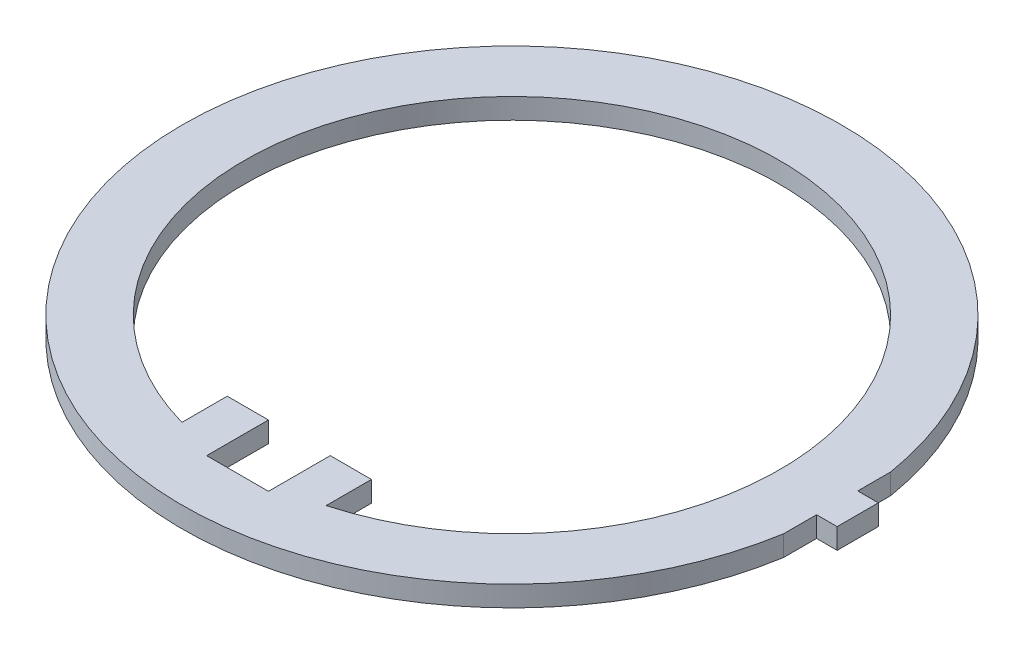
ISO-10303-21;
HEADER;
FILE_DESCRIPTION(('STEP AP214'),'2;1');
FILE_NAME('part.step','',(''),(''),'','','');
FILE_SCHEMA(('AUTOMOTIVE_DESIGN { 1 0 10303 214 1 1 1 1 }'));
ENDSEC;
DATA;
#1=APPLICATION_CONTEXT('core data for automotive mechanical design processes');
#2=APPLICATION_PROTOCOL_DEFINITION('international standard','automotive_design',2000,#1);
#3=PRODUCT_CONTEXT('',#1,'mechanical');
#4=PRODUCT('Part','Part','',(#3));
#5=PRODUCT_RELATED_PRODUCT_CATEGORY('part','',(#4));
#6=PRODUCT_DEFINITION_FORMATION('','',#4);
#7=PRODUCT_DEFINITION_CONTEXT('part definition',#1,'design');
#8=PRODUCT_DEFINITION('design','',#6,#7);
#9=PRODUCT_DEFINITION_SHAPE('','',#8);
#10=(LENGTH_UNIT() NAMED_UNIT(*) SI_UNIT(.MILLI.,.METRE.));
#11=(NAMED_UNIT(*) PLANE_ANGLE_UNIT() SI_UNIT($,.RADIAN.));
#12=(NAMED_UNIT(*) SI_UNIT($,.STERADIAN.) SOLID_ANGLE_UNIT());
#13=UNCERTAINTY_MEASURE_WITH_UNIT(LENGTH_MEASURE(1.E-05),#10,'distance_accuracy_value','');
#14=(GEOMETRIC_REPRESENTATION_CONTEXT(3) GLOBAL_UNCERTAINTY_ASSIGNED_CONTEXT((#13)) GLOBAL_UNIT_ASSIGNED_CONTEXT((#10,
#11,#12)) REPRESENTATION_CONTEXT('',''));
#15=CARTESIAN_POINT('',(0.,0.,0.));
#16=DIRECTION('',(0.,0.,1.));
#17=DIRECTION('',(1.,0.,0.));
#18=AXIS2_PLACEMENT_3D('',#15,#16,#17);
#19=CARTESIAN_POINT('',(9.525,6.35,-84.5818985622356));
#20=DIRECTION('',(0.,1.,0.));
#21=DIRECTION('',(0.,0.,1.));
#22=AXIS2_PLACEMENT_3D('',#19,#20,#21);
#23=PLANE('',#22);
#24=CARTESIAN_POINT('',(9.525,6.35,-84.5818985622356));
#25=DIRECTION('',(0.,1.,0.));
#26=DIRECTION('',(0.,0.,1.));
#27=AXIS2_PLACEMENT_3D('',#24,#25,#26);
#28=CIRCLE('',#27,101.6);
#29=CARTESIAN_POINT('',(109.774588029079,6.35,-101.091898562236));
#30=VERTEX_POINT('',#29);
#31=CARTESIAN_POINT('',(109.774588029079,6.35,-68.0718985622356));
#32=VERTEX_POINT('',#31);
#33=EDGE_CURVE('E199',#30,#32,#28,.T.);
#34=ORIENTED_EDGE('',*,*,#33,.T.);
#35=DIRECTION('',(0.,0.,-1.));
#36=VECTOR('',#35,1.);
#37=CARTESIAN_POINT('',(109.774588029079,6.35,-78.2318985622356));
#38=LINE('',#37,#36);
#39=CARTESIAN_POINT('',(109.774588029079,6.35,-78.2318985622356));
#40=VERTEX_POINT('',#39);
#41=EDGE_CURVE('E202',#32,#40,#38,.T.);
#42=ORIENTED_EDGE('',*,*,#41,.T.);
#43=DIRECTION('',(1.,0.,0.));
#44=VECTOR('',#43,1.);
#45=CARTESIAN_POINT('',(116.124588029079,6.35,-78.2318985622356));
#46=LINE('',#45,#44);
#47=CARTESIAN_POINT('',(116.124588029079,6.35,-78.2318985622356));
#48=VERTEX_POINT('',#47);
#49=EDGE_CURVE('E205',#40,#48,#46,.T.);
#50=ORIENTED_EDGE('',*,*,#49,.T.);
#51=DIRECTION('',(0.,0.,-1.));
#52=VECTOR('',#51,1.);
#53=CARTESIAN_POINT('',(116.124588029079,6.35,-90.9318985622356));
#54=LINE('',#53,#52);
#55=CARTESIAN_POINT('',(116.124588029079,6.35,-90.9318985622356));
#56=VERTEX_POINT('',#55);
#57=EDGE_CURVE('E207',#48,#56,#54,.T.);
#58=ORIENTED_EDGE('',*,*,#57,.T.);
#59=DIRECTION('',(-1.,0.,0.));
#60=VECTOR('',#59,1.);
#61=CARTESIAN_POINT('',(109.774588029079,6.35,-90.9318985622356));
#62=LINE('',#61,#60);
#63=CARTESIAN_POINT('',(109.774588029079,6.35,-90.9318985622356));
#64=VERTEX_POINT('',#63);
#65=EDGE_CURVE('E209',#56,#64,#62,.T.);
#66=ORIENTED_EDGE('',*,*,#65,.T.);
#67=DIRECTION('',(0.,0.,-1.));
#68=VECTOR('',#67,1.);
#69=CARTESIAN_POINT('',(109.774588029079,6.35,-101.091898562236));
#70=LINE('',#69,#68);
#71=EDGE_CURVE('E211',#64,#30,#70,.T.);
#72=ORIENTED_EDGE('',*,*,#71,.T.);
#73=EDGE_LOOP('',(#34,#42,#50,#58,#66,#72));
#74=FACE_BOUND('',#73,.T.);
#75=DIRECTION('',(1.,0.,0.));
#76=VECTOR('',#75,1.);
#77=CARTESIAN_POINT('',(0.,6.35,0.));
#78=LINE('',#77,#76);
#79=CARTESIAN_POINT('',(0.,6.35,0.));
#80=VERTEX_POINT('',#79);
#81=CARTESIAN_POINT('',(19.05,6.35,0.));
#82=VERTEX_POINT('',#81);
#83=EDGE_CURVE('E142',#80,#82,#78,.T.);
#84=ORIENTED_EDGE('',*,*,#83,.F.);
#85=DIRECTION('',(0.,0.,1.));
#86=VECTOR('',#85,1.);
#87=CARTESIAN_POINT('',(0.,6.35,0.));
#88=LINE('',#87,#86);
#89=CARTESIAN_POINT('',(0.,6.35,-19.05));
#90=VERTEX_POINT('',#89);
#91=EDGE_CURVE('E134',#90,#80,#88,.T.);
#92=ORIENTED_EDGE('',*,*,#91,.F.);
#93=DIRECTION('',(1.,0.,0.));
#94=VECTOR('',#93,1.);
#95=CARTESIAN_POINT('',(0.,6.35,-19.05));
#96=LINE('',#95,#94);
#97=CARTESIAN_POINT('',(-12.7,6.35,-19.05));
#98=VERTEX_POINT('',#97);
#99=EDGE_CURVE('E167',#98,#90,#96,.T.);
#100=ORIENTED_EDGE('',*,*,#99,.F.);
#101=DIRECTION('',(0.,0.,-1.));
#102=VECTOR('',#101,1.);
#103=CARTESIAN_POINT('',(-12.7,6.35,-19.05));
#104=LINE('',#103,#102);
#105=CARTESIAN_POINT('',(-12.7,6.35,-5.07999999999997));
#106=VERTEX_POINT('',#105);
#107=EDGE_CURVE('E165',#106,#98,#104,.T.);
#108=ORIENTED_EDGE('',*,*,#107,.F.);
#109=CARTESIAN_POINT('',(9.525,6.35,-84.5818985622356));
#110=DIRECTION('',(0.,1.,0.));
#111=DIRECTION('',(0.,0.,-1.));
#112=AXIS2_PLACEMENT_3D('',#109,#110,#111);
#113=CIRCLE('',#112,82.55);
#114=CARTESIAN_POINT('',(31.75,6.35,-5.08));
#115=VERTEX_POINT('',#114);
#116=EDGE_CURVE('E163',#115,#106,#113,.T.);
#117=ORIENTED_EDGE('',*,*,#116,.F.);
#118=DIRECTION('',(0.,0.,1.));
#119=VECTOR('',#118,1.);
#120=CARTESIAN_POINT('',(31.75,6.35,-19.05));
#121=LINE('',#120,#119);
#122=CARTESIAN_POINT('',(31.75,6.35,-19.05));
#123=VERTEX_POINT('',#122);
#124=EDGE_CURVE('E161',#123,#115,#121,.T.);
#125=ORIENTED_EDGE('',*,*,#124,.F.);
#126=DIRECTION('',(1.,0.,0.));
#127=VECTOR('',#126,1.);
#128=CARTESIAN_POINT('',(19.05,6.35,-19.05));
#129=LINE('',#128,#127);
#130=CARTESIAN_POINT('',(19.05,6.35,-19.05));
#131=VERTEX_POINT('',#130);
#132=EDGE_CURVE('E157',#131,#123,#129,.T.);
#133=ORIENTED_EDGE('',*,*,#132,.F.);
#134=DIRECTION('',(0.,0.,-1.));
#135=VECTOR('',#134,1.);
#136=CARTESIAN_POINT('',(19.05,6.35,0.));
#137=LINE('',#136,#135);
#138=EDGE_CURVE('E155',#82,#131,#137,.T.);
#139=ORIENTED_EDGE('',*,*,#138,.F.);
#140=EDGE_LOOP('',(#84,#92,#100,#108,#117,#125,#133,#139));
#141=FACE_BOUND('',#140,.T.);
#142=ADVANCED_FACE('F33',(#74,#141),#23,.T.);
#143=CARTESIAN_POINT('',(9.525,0.,-84.5818985622356));
#144=DIRECTION('',(0.,1.,0.));
#145=DIRECTION('',(0.,0.,1.));
#146=AXIS2_PLACEMENT_3D('',#143,#144,#145);
#147=PLANE('',#146);
#148=CARTESIAN_POINT('',(9.525,0.,-84.5818985622356));
#149=DIRECTION('',(0.,1.,0.));
#150=DIRECTION('',(0.,0.,1.));
#151=AXIS2_PLACEMENT_3D('',#148,#149,#150);
#152=CIRCLE('',#151,101.6);
#153=CARTESIAN_POINT('',(109.774588029079,0.,-101.091898562236));
#154=VERTEX_POINT('',#153);
#155=CARTESIAN_POINT('',(109.774588029079,0.,-68.0718985622356));
#156=VERTEX_POINT('',#155);
#157=EDGE_CURVE('E150',#154,#156,#152,.T.);
#158=ORIENTED_EDGE('',*,*,#157,.F.);
#159=DIRECTION('',(0.,0.,-1.));
#160=VECTOR('',#159,1.);
#161=CARTESIAN_POINT('',(109.774588029079,0.,-101.091898562236));
#162=LINE('',#161,#160);
#163=CARTESIAN_POINT('',(109.774588029079,0.,-90.9318985622356));
#164=VERTEX_POINT('',#163);
#165=EDGE_CURVE('E203',#164,#154,#162,.T.);
#166=ORIENTED_EDGE('',*,*,#165,.F.);
#167=DIRECTION('',(-1.,0.,0.));
#168=VECTOR('',#167,1.);
#169=CARTESIAN_POINT('',(109.774588029079,0.,-90.9318985622356));
#170=LINE('',#169,#168);
#171=CARTESIAN_POINT('',(116.124588029079,0.,-90.9318985622356));
#172=VERTEX_POINT('',#171);
#173=EDGE_CURVE('E222',#172,#164,#170,.T.);
#174=ORIENTED_EDGE('',*,*,#173,.F.);
#175=DIRECTION('',(0.,0.,-1.));
#176=VECTOR('',#175,1.);
#177=CARTESIAN_POINT('',(116.124588029079,0.,-90.9318985622356));
#178=LINE('',#177,#176);
#179=CARTESIAN_POINT('',(116.124588029079,0.,-78.2318985622356));
#180=VERTEX_POINT('',#179);
#181=EDGE_CURVE('E220',#180,#172,#178,.T.);
#182=ORIENTED_EDGE('',*,*,#181,.F.);
#183=DIRECTION('',(1.,0.,0.));
#184=VECTOR('',#183,1.);
#185=CARTESIAN_POINT('',(116.124588029079,0.,-78.2318985622356));
#186=LINE('',#185,#184);
#187=CARTESIAN_POINT('',(109.774588029079,0.,-78.2318985622356));
#188=VERTEX_POINT('',#187);
#189=EDGE_CURVE('E218',#188,#180,#186,.T.);
#190=ORIENTED_EDGE('',*,*,#189,.F.);
#191=DIRECTION('',(0.,0.,-1.));
#192=VECTOR('',#191,1.);
#193=CARTESIAN_POINT('',(109.774588029079,0.,-78.2318985622356));
#194=LINE('',#193,#192);
#195=EDGE_CURVE('E216',#156,#188,#194,.T.);
#196=ORIENTED_EDGE('',*,*,#195,.F.);
#197=EDGE_LOOP('',(#158,#166,#174,#182,#190,#196));
#198=FACE_BOUND('',#197,.T.);
#199=DIRECTION('',(0.,0.,1.));
#200=VECTOR('',#199,1.);
#201=CARTESIAN_POINT('',(0.,0.,0.));
#202=LINE('',#201,#200);
#203=CARTESIAN_POINT('',(0.,0.,-19.05));
#204=VERTEX_POINT('',#203);
#205=CARTESIAN_POINT('',(0.,0.,0.));
#206=VERTEX_POINT('',#205);
#207=EDGE_CURVE('E56',#204,#206,#202,.T.);
#208=ORIENTED_EDGE('',*,*,#207,.T.);
#209=DIRECTION('',(1.,0.,0.));
#210=VECTOR('',#209,1.);
#211=CARTESIAN_POINT('',(0.,0.,0.));
#212=LINE('',#211,#210);
#213=CARTESIAN_POINT('',(19.05,0.,0.));
#214=VERTEX_POINT('',#213);
#215=EDGE_CURVE('E149',#206,#214,#212,.T.);
#216=ORIENTED_EDGE('',*,*,#215,.T.);
#217=DIRECTION('',(0.,0.,-1.));
#218=VECTOR('',#217,1.);
#219=CARTESIAN_POINT('',(19.05,0.,0.));
#220=LINE('',#219,#218);
#221=CARTESIAN_POINT('',(19.05,0.,-19.05));
#222=VERTEX_POINT('',#221);
#223=EDGE_CURVE('E171',#214,#222,#220,.T.);
#224=ORIENTED_EDGE('',*,*,#223,.T.);
#225=DIRECTION('',(1.,0.,0.));
#226=VECTOR('',#225,1.);
#227=CARTESIAN_POINT('',(19.05,0.,-19.05));
#228=LINE('',#227,#226);
#229=CARTESIAN_POINT('',(31.75,0.,-19.05));
#230=VERTEX_POINT('',#229);
#231=EDGE_CURVE('E174',#222,#230,#228,.T.);
#232=ORIENTED_EDGE('',*,*,#231,.T.);
#233=DIRECTION('',(0.,0.,1.));
#234=VECTOR('',#233,1.);
#235=CARTESIAN_POINT('',(31.75,0.,-19.05));
#236=LINE('',#235,#234);
#237=CARTESIAN_POINT('',(31.75,0.,-5.08));
#238=VERTEX_POINT('',#237);
#239=EDGE_CURVE('E177',#230,#238,#236,.T.);
#240=ORIENTED_EDGE('',*,*,#239,.T.);
#241=CARTESIAN_POINT('',(9.525,0.,-84.5818985622356));
#242=DIRECTION('',(0.,1.,0.));
#243=DIRECTION('',(0.,0.,-1.));
#244=AXIS2_PLACEMENT_3D('',#241,#242,#243);
#245=CIRCLE('',#244,82.55);
#246=CARTESIAN_POINT('',(-12.7,0.,-5.07999999999997));
#247=VERTEX_POINT('',#246);
#248=EDGE_CURVE('E180',#238,#247,#245,.T.);
#249=ORIENTED_EDGE('',*,*,#248,.T.);
#250=DIRECTION('',(0.,0.,-1.));
#251=VECTOR('',#250,1.);
#252=CARTESIAN_POINT('',(-12.7,0.,-19.05));
#253=LINE('',#252,#251);
#254=CARTESIAN_POINT('',(-12.7,0.,-19.05));
#255=VERTEX_POINT('',#254);
#256=EDGE_CURVE('E183',#247,#255,#253,.T.);
#257=ORIENTED_EDGE('',*,*,#256,.T.);
#258=DIRECTION('',(1.,0.,0.));
#259=VECTOR('',#258,1.);
#260=CARTESIAN_POINT('',(0.,0.,-19.05));
#261=LINE('',#260,#259);
#262=EDGE_CURVE('E143',#255,#204,#261,.T.);
#263=ORIENTED_EDGE('',*,*,#262,.T.);
#264=EDGE_LOOP('',(#208,#216,#224,#232,#240,#249,#257,#263));
#265=FACE_BOUND('',#264,.T.);
#266=ADVANCED_FACE('F246',(#198,#265),#147,.F.);
#267=CARTESIAN_POINT('',(9.525,6.35,-84.5818985622356));
#268=DIRECTION('',(0.,-1.,0.));
#269=DIRECTION('',(0.,0.,-1.));
#270=AXIS2_PLACEMENT_3D('',#267,#268,#269);
#271=CYLINDRICAL_SURFACE('',#270,101.6);
#272=ORIENTED_EDGE('',*,*,#157,.T.);
#273=DIRECTION('',(0.,-1.,0.));
#274=VECTOR('',#273,1.);
#275=CARTESIAN_POINT('',(109.774588029079,6.35,-68.0718985622356));
#276=LINE('',#275,#274);
#277=EDGE_CURVE('E11',#32,#156,#276,.T.);
#278=ORIENTED_EDGE('',*,*,#277,.F.);
#279=ORIENTED_EDGE('',*,*,#33,.F.);
#280=DIRECTION('',(0.,-1.,0.));
#281=VECTOR('',#280,1.);
#282=CARTESIAN_POINT('',(109.774588029079,6.35,-101.091898562236));
#283=LINE('',#282,#281);
#284=EDGE_CURVE('E213',#30,#154,#283,.T.);
#285=ORIENTED_EDGE('',*,*,#284,.T.);
#286=EDGE_LOOP('',(#272,#278,#279,#285));
#287=FACE_BOUND('',#286,.T.);
#288=ADVANCED_FACE('F35',(#287),#271,.T.);
#289=CARTESIAN_POINT('',(109.774588029079,6.35,-78.2318985622356));
#290=DIRECTION('',(-1.,0.,0.));
#291=DIRECTION('',(0.,0.,1.));
#292=AXIS2_PLACEMENT_3D('',#289,#290,#291);
#293=PLANE('',#292);
#294=ORIENTED_EDGE('',*,*,#195,.T.);
#295=DIRECTION('',(0.,-1.,0.));
#296=VECTOR('',#295,1.);
#297=CARTESIAN_POINT('',(109.774588029079,6.35,-78.2318985622356));
#298=LINE('',#297,#296);
#299=EDGE_CURVE('E41',#40,#188,#298,.T.);
#300=ORIENTED_EDGE('',*,*,#299,.F.);
#301=ORIENTED_EDGE('',*,*,#41,.F.);
#302=ORIENTED_EDGE('',*,*,#277,.T.);
#303=EDGE_LOOP('',(#294,#300,#301,#302));
#304=FACE_BOUND('',#303,.T.);
#305=ADVANCED_FACE('F263',(#304),#293,.F.);
#306=CARTESIAN_POINT('',(116.124588029079,6.35,-78.2318985622356));
#307=DIRECTION('',(0.,0.,-1.));
#308=DIRECTION('',(-1.,0.,0.));
#309=AXIS2_PLACEMENT_3D('',#306,#307,#308);
#310=PLANE('',#309);
#311=ORIENTED_EDGE('',*,*,#189,.T.);
#312=DIRECTION('',(0.,-1.,0.));
#313=VECTOR('',#312,1.);
#314=CARTESIAN_POINT('',(116.124588029079,6.35,-78.2318985622356));
#315=LINE('',#314,#313);
#316=EDGE_CURVE('E233',#48,#180,#315,.T.);
#317=ORIENTED_EDGE('',*,*,#316,.F.);
#318=ORIENTED_EDGE('',*,*,#49,.F.);
#319=ORIENTED_EDGE('',*,*,#299,.T.);
#320=EDGE_LOOP('',(#311,#317,#318,#319));
#321=FACE_BOUND('',#320,.T.);
#322=ADVANCED_FACE('F240',(#321),#310,.F.);
#323=CARTESIAN_POINT('',(116.124588029079,6.35,-90.9318985622356));
#324=DIRECTION('',(-1.,0.,0.));
#325=DIRECTION('',(0.,0.,1.));
#326=AXIS2_PLACEMENT_3D('',#323,#324,#325);
#327=PLANE('',#326);
#328=ORIENTED_EDGE('',*,*,#181,.T.);
#329=DIRECTION('',(0.,-1.,0.));
#330=VECTOR('',#329,1.);
#331=CARTESIAN_POINT('',(116.124588029079,6.35,-90.9318985622356));
#332=LINE('',#331,#330);
#333=EDGE_CURVE('E230',#56,#172,#332,.T.);
#334=ORIENTED_EDGE('',*,*,#333,.F.);
#335=ORIENTED_EDGE('',*,*,#57,.F.);
#336=ORIENTED_EDGE('',*,*,#316,.T.);
#337=EDGE_LOOP('',(#328,#334,#335,#336));
#338=FACE_BOUND('',#337,.T.);
#339=ADVANCED_FACE('F252',(#338),#327,.F.);
#340=CARTESIAN_POINT('',(109.774588029079,6.35,-90.9318985622356));
#341=DIRECTION('',(0.,0.,1.));
#342=DIRECTION('',(1.,0.,0.));
#343=AXIS2_PLACEMENT_3D('',#340,#341,#342);
#344=PLANE('',#343);
#345=ORIENTED_EDGE('',*,*,#173,.T.);
#346=DIRECTION('',(0.,-1.,0.));
#347=VECTOR('',#346,1.);
#348=CARTESIAN_POINT('',(109.774588029079,6.35,-90.9318985622356));
#349=LINE('',#348,#347);
#350=EDGE_CURVE('E227',#64,#164,#349,.T.);
#351=ORIENTED_EDGE('',*,*,#350,.F.);
#352=ORIENTED_EDGE('',*,*,#65,.F.);
#353=ORIENTED_EDGE('',*,*,#333,.T.);
#354=EDGE_LOOP('',(#345,#351,#352,#353));
#355=FACE_BOUND('',#354,.T.);
#356=ADVANCED_FACE('F256',(#355),#344,.F.);
#357=CARTESIAN_POINT('',(109.774588029079,6.35,-101.091898562236));
#358=DIRECTION('',(-1.,0.,0.));
#359=DIRECTION('',(0.,0.,1.));
#360=AXIS2_PLACEMENT_3D('',#357,#358,#359);
#361=PLANE('',#360);
#362=ORIENTED_EDGE('',*,*,#165,.T.);
#363=ORIENTED_EDGE('',*,*,#284,.F.);
#364=ORIENTED_EDGE('',*,*,#71,.F.);
#365=ORIENTED_EDGE('',*,*,#350,.T.);
#366=EDGE_LOOP('',(#362,#363,#364,#365));
#367=FACE_BOUND('',#366,.T.);
#368=ADVANCED_FACE('F266',(#367),#361,.F.);
#369=CARTESIAN_POINT('',(0.,6.35,0.));
#370=DIRECTION('',(1.,0.,0.));
#371=DIRECTION('',(0.,0.,-1.));
#372=AXIS2_PLACEMENT_3D('',#369,#370,#371);
#373=PLANE('',#372);
#374=ORIENTED_EDGE('',*,*,#207,.F.);
#375=DIRECTION('',(0.,-1.,0.));
#376=VECTOR('',#375,1.);
#377=CARTESIAN_POINT('',(0.,6.35,-19.05));
#378=LINE('',#377,#376);
#379=EDGE_CURVE('E138',#90,#204,#378,.T.);
#380=ORIENTED_EDGE('',*,*,#379,.F.);
#381=ORIENTED_EDGE('',*,*,#91,.T.);
#382=DIRECTION('',(0.,-1.,0.));
#383=VECTOR('',#382,1.);
#384=CARTESIAN_POINT('',(0.,6.35,0.));
#385=LINE('',#384,#383);
#386=EDGE_CURVE('E137',#80,#206,#385,.T.);
#387=ORIENTED_EDGE('',*,*,#386,.T.);
#388=EDGE_LOOP('',(#374,#380,#381,#387));
#389=FACE_BOUND('',#388,.T.);
#390=ADVANCED_FACE('F136',(#389),#373,.T.);
#391=CARTESIAN_POINT('',(0.,6.35,0.));
#392=DIRECTION('',(0.,0.,-1.));
#393=DIRECTION('',(-1.,0.,0.));
#394=AXIS2_PLACEMENT_3D('',#391,#392,#393);
#395=PLANE('',#394);
#396=ORIENTED_EDGE('',*,*,#215,.F.);
#397=ORIENTED_EDGE('',*,*,#386,.F.);
#398=ORIENTED_EDGE('',*,*,#83,.T.);
#399=DIRECTION('',(0.,-1.,0.));
#400=VECTOR('',#399,1.);
#401=CARTESIAN_POINT('',(19.05,6.35,0.));
#402=LINE('',#401,#400);
#403=EDGE_CURVE('E151',#82,#214,#402,.T.);
#404=ORIENTED_EDGE('',*,*,#403,.T.);
#405=EDGE_LOOP('',(#396,#397,#398,#404));
#406=FACE_BOUND('',#405,.T.);
#407=ADVANCED_FACE('F146',(#406),#395,.T.);
#408=CARTESIAN_POINT('',(19.05,6.35,0.));
#409=DIRECTION('',(-1.,0.,0.));
#410=DIRECTION('',(0.,0.,1.));
#411=AXIS2_PLACEMENT_3D('',#408,#409,#410);
#412=PLANE('',#411);
#413=ORIENTED_EDGE('',*,*,#223,.F.);
#414=ORIENTED_EDGE('',*,*,#403,.F.);
#415=ORIENTED_EDGE('',*,*,#138,.T.);
#416=DIRECTION('',(0.,-1.,0.));
#417=VECTOR('',#416,1.);
#418=CARTESIAN_POINT('',(19.05,6.35,-19.05));
#419=LINE('',#418,#417);
#420=EDGE_CURVE('E196',#131,#222,#419,.T.);
#421=ORIENTED_EDGE('',*,*,#420,.T.);
#422=EDGE_LOOP('',(#413,#414,#415,#421));
#423=FACE_BOUND('',#422,.T.);
#424=ADVANCED_FACE('F284',(#423),#412,.T.);
#425=CARTESIAN_POINT('',(19.05,6.35,-19.05));
#426=DIRECTION('',(0.,0.,-1.));
#427=DIRECTION('',(-1.,0.,0.));
#428=AXIS2_PLACEMENT_3D('',#425,#426,#427);
#429=PLANE('',#428);
#430=ORIENTED_EDGE('',*,*,#231,.F.);
#431=ORIENTED_EDGE('',*,*,#420,.F.);
#432=ORIENTED_EDGE('',*,*,#132,.T.);
#433=DIRECTION('',(0.,-1.,0.));
#434=VECTOR('',#433,1.);
#435=CARTESIAN_POINT('',(31.75,6.35,-19.05));
#436=LINE('',#435,#434);
#437=EDGE_CURVE('E194',#123,#230,#436,.T.);
#438=ORIENTED_EDGE('',*,*,#437,.T.);
#439=EDGE_LOOP('',(#430,#431,#432,#438));
#440=FACE_BOUND('',#439,.T.);
#441=ADVANCED_FACE('F287',(#440),#429,.T.);
#442=CARTESIAN_POINT('',(31.75,6.35,-19.05));
#443=DIRECTION('',(1.,0.,0.));
#444=DIRECTION('',(0.,0.,-1.));
#445=AXIS2_PLACEMENT_3D('',#442,#443,#444);
#446=PLANE('',#445);
#447=ORIENTED_EDGE('',*,*,#239,.F.);
#448=ORIENTED_EDGE('',*,*,#437,.F.);
#449=ORIENTED_EDGE('',*,*,#124,.T.);
#450=DIRECTION('',(0.,-1.,0.));
#451=VECTOR('',#450,1.);
#452=CARTESIAN_POINT('',(31.75,6.35,-5.08));
#453=LINE('',#452,#451);
#454=EDGE_CURVE('E192',#115,#238,#453,.T.);
#455=ORIENTED_EDGE('',*,*,#454,.T.);
#456=EDGE_LOOP('',(#447,#448,#449,#455));
#457=FACE_BOUND('',#456,.T.);
#458=ADVANCED_FACE('F291',(#457),#446,.T.);
#459=CARTESIAN_POINT('',(9.525,6.35,-84.5818985622356));
#460=DIRECTION('',(0.,-1.,0.));
#461=DIRECTION('',(0.,0.,-1.));
#462=AXIS2_PLACEMENT_3D('',#459,#460,#461);
#463=CYLINDRICAL_SURFACE('',#462,82.55);
#464=ORIENTED_EDGE('',*,*,#248,.F.);
#465=ORIENTED_EDGE('',*,*,#454,.F.);
#466=ORIENTED_EDGE('',*,*,#116,.T.);
#467=DIRECTION('',(0.,-1.,0.));
#468=VECTOR('',#467,1.);
#469=CARTESIAN_POINT('',(-12.7,6.35,-5.07999999999997));
#470=LINE('',#469,#468);
#471=EDGE_CURVE('E190',#106,#247,#470,.T.);
#472=ORIENTED_EDGE('',*,*,#471,.T.);
#473=EDGE_LOOP('',(#464,#465,#466,#472));
#474=FACE_BOUND('',#473,.T.);
#475=ADVANCED_FACE('F295',(#474),#463,.F.);
#476=CARTESIAN_POINT('',(-12.7,6.35,-19.05));
#477=DIRECTION('',(-1.,0.,0.));
#478=DIRECTION('',(0.,0.,1.));
#479=AXIS2_PLACEMENT_3D('',#476,#477,#478);
#480=PLANE('',#479);
#481=ORIENTED_EDGE('',*,*,#256,.F.);
#482=ORIENTED_EDGE('',*,*,#471,.F.);
#483=ORIENTED_EDGE('',*,*,#107,.T.);
#484=DIRECTION('',(0.,-1.,0.));
#485=VECTOR('',#484,1.);
#486=CARTESIAN_POINT('',(-12.7,6.35,-19.05));
#487=LINE('',#486,#485);
#488=EDGE_CURVE('E48',#98,#255,#487,.T.);
#489=ORIENTED_EDGE('',*,*,#488,.T.);
#490=EDGE_LOOP('',(#481,#482,#483,#489));
#491=FACE_BOUND('',#490,.T.);
#492=ADVANCED_FACE('F299',(#491),#480,.T.);
#493=CARTESIAN_POINT('',(0.,6.35,-19.05));
#494=DIRECTION('',(0.,0.,-1.));
#495=DIRECTION('',(-1.,0.,0.));
#496=AXIS2_PLACEMENT_3D('',#493,#494,#495);
#497=PLANE('',#496);
#498=ORIENTED_EDGE('',*,*,#262,.F.);
#499=ORIENTED_EDGE('',*,*,#488,.F.);
#500=ORIENTED_EDGE('',*,*,#99,.T.);
#501=ORIENTED_EDGE('',*,*,#379,.T.);
#502=EDGE_LOOP('',(#498,#499,#500,#501));
#503=FACE_BOUND('',#502,.T.);
#504=ADVANCED_FACE('F303',(#503),#497,.T.);
#505=CLOSED_SHELL('',(#142,#266,#288,#305,#322,#339,#356,#368,#390,#407,#424,#441,#458,#475,
#492,#504));
#506=MANIFOLD_SOLID_BREP('B2',#505);
#507=ADVANCED_BREP_SHAPE_REPRESENTATION('',(#18,#506),#14);
#508=SHAPE_DEFINITION_REPRESENTATION(#9,#507);
ENDSEC;
END-ISO-10303-21;
